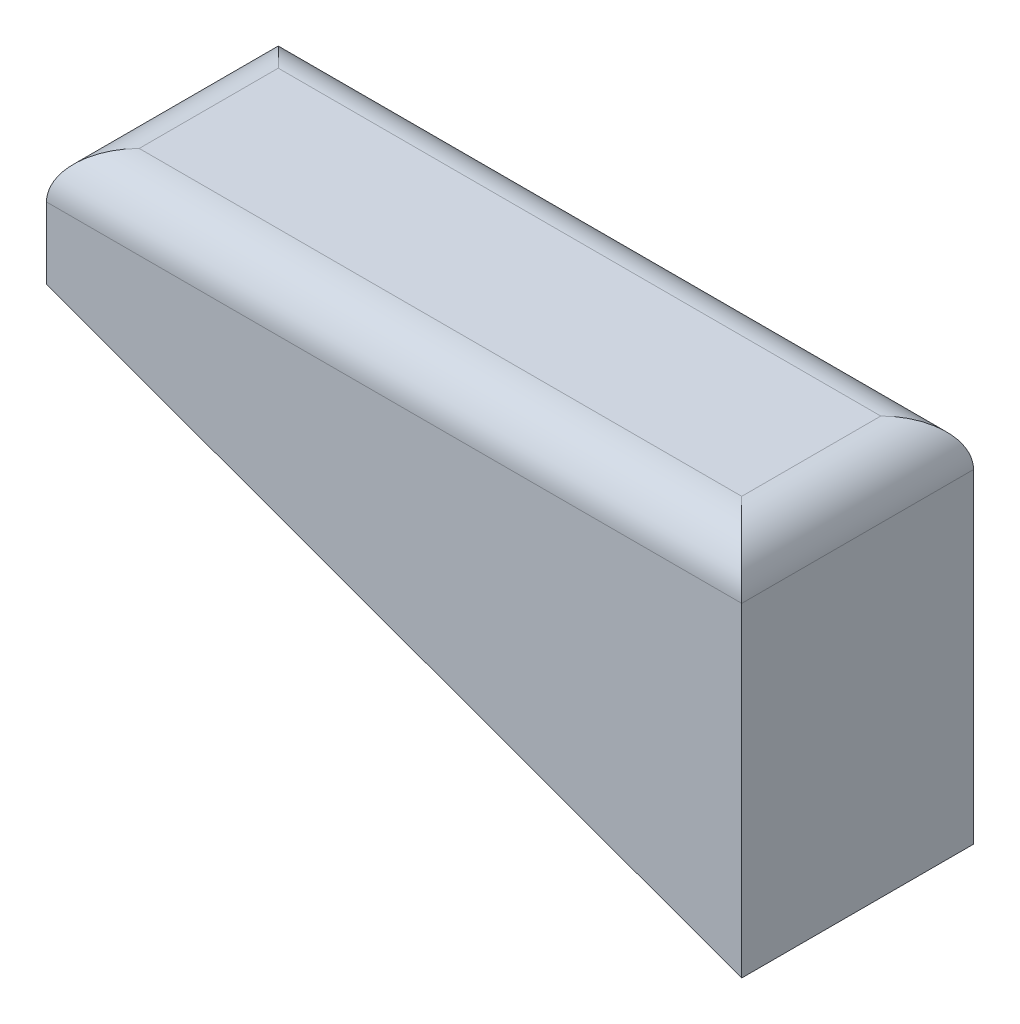
ISO-10303-21;
HEADER;
FILE_DESCRIPTION(('STEP AP214'),'2;1');
FILE_NAME('part.step','',(''),(''),'','','');
FILE_SCHEMA(('AUTOMOTIVE_DESIGN { 1 0 10303 214 1 1 1 1 }'));
ENDSEC;
DATA;
#1=APPLICATION_CONTEXT('core data for automotive mechanical design processes');
#2=APPLICATION_PROTOCOL_DEFINITION('international standard','automotive_design',2000,#1);
#3=PRODUCT_CONTEXT('',#1,'mechanical');
#4=PRODUCT('Part','Part','',(#3));
#5=PRODUCT_RELATED_PRODUCT_CATEGORY('part','',(#4));
#6=PRODUCT_DEFINITION_FORMATION('','',#4);
#7=PRODUCT_DEFINITION_CONTEXT('part definition',#1,'design');
#8=PRODUCT_DEFINITION('design','',#6,#7);
#9=PRODUCT_DEFINITION_SHAPE('','',#8);
#10=(LENGTH_UNIT() NAMED_UNIT(*) SI_UNIT(.MILLI.,.METRE.));
#11=(NAMED_UNIT(*) PLANE_ANGLE_UNIT() SI_UNIT($,.RADIAN.));
#12=(NAMED_UNIT(*) SI_UNIT($,.STERADIAN.) SOLID_ANGLE_UNIT());
#13=UNCERTAINTY_MEASURE_WITH_UNIT(LENGTH_MEASURE(1.E-05),#10,'distance_accuracy_value','');
#14=(GEOMETRIC_REPRESENTATION_CONTEXT(3) GLOBAL_UNCERTAINTY_ASSIGNED_CONTEXT((#13)) GLOBAL_UNIT_ASSIGNED_CONTEXT((#10,
#11,#12)) REPRESENTATION_CONTEXT('',''));
#15=CARTESIAN_POINT('',(0.,0.,0.));
#16=DIRECTION('',(0.,0.,1.));
#17=DIRECTION('',(1.,0.,0.));
#18=AXIS2_PLACEMENT_3D('',#15,#16,#17);
#19=CARTESIAN_POINT('',(0.,0.,5.));
#20=DIRECTION('',(1.,0.,0.));
#21=DIRECTION('',(0.,1.,0.));
#22=AXIS2_PLACEMENT_3D('',#19,#20,#21);
#23=PLANE('',#22);
#24=DIRECTION('',(0.,-1.,0.));
#25=VECTOR('',#24,1.);
#26=CARTESIAN_POINT('',(0.,0.,0.));
#27=LINE('',#26,#25);
#28=CARTESIAN_POINT('',(0.,7.,0.));
#29=VERTEX_POINT('',#28);
#30=CARTESIAN_POINT('',(0.,0.,0.));
#31=VERTEX_POINT('',#30);
#32=EDGE_CURVE('E113',#29,#31,#27,.T.);
#33=ORIENTED_EDGE('',*,*,#32,.F.);
#34=DIRECTION('',(0.,0.,-1.));
#35=VECTOR('',#34,1.);
#36=CARTESIAN_POINT('',(0.,7.,5.));
#37=LINE('',#36,#35);
#38=CARTESIAN_POINT('',(0.,7.,5.));
#39=VERTEX_POINT('',#38);
#40=EDGE_CURVE('E11',#29,#39,#37,.F.);
#41=ORIENTED_EDGE('',*,*,#40,.T.);
#42=DIRECTION('',(0.,-1.,0.));
#43=VECTOR('',#42,1.);
#44=CARTESIAN_POINT('',(0.,0.,5.));
#45=LINE('',#44,#43);
#46=CARTESIAN_POINT('',(0.,0.,5.));
#47=VERTEX_POINT('',#46);
#48=EDGE_CURVE('E104',#39,#47,#45,.T.);
#49=ORIENTED_EDGE('',*,*,#48,.T.);
#50=DIRECTION('',(0.,0.,-1.));
#51=VECTOR('',#50,1.);
#52=CARTESIAN_POINT('',(0.,0.,5.));
#53=LINE('',#52,#51);
#54=EDGE_CURVE('E99',#47,#31,#53,.T.);
#55=ORIENTED_EDGE('',*,*,#54,.T.);
#56=EDGE_LOOP('',(#33,#41,#49,#55));
#57=FACE_BOUND('',#56,.T.);
#58=ADVANCED_FACE('F35',(#57),#23,.T.);
#59=CARTESIAN_POINT('',(0.,8.,5.));
#60=DIRECTION('',(0.,1.,0.));
#61=DIRECTION('',(0.,0.,1.));
#62=AXIS2_PLACEMENT_3D('',#59,#60,#61);
#63=PLANE('',#62);
#64=DIRECTION('',(0.,0.,-1.));
#65=VECTOR('',#64,1.);
#66=CARTESIAN_POINT('',(-1.,8.,5.));
#67=LINE('',#66,#65);
#68=CARTESIAN_POINT('',(-1.,8.,4.));
#69=VERTEX_POINT('',#68);
#70=CARTESIAN_POINT('',(-1.,8.,1.));
#71=VERTEX_POINT('',#70);
#72=EDGE_CURVE('E120',#69,#71,#67,.T.);
#73=ORIENTED_EDGE('',*,*,#72,.T.);
#74=DIRECTION('',(1.,0.,0.));
#75=VECTOR('',#74,1.);
#76=CARTESIAN_POINT('',(-15.,8.,1.));
#77=LINE('',#76,#75);
#78=CARTESIAN_POINT('',(-14.,8.,1.));
#79=VERTEX_POINT('',#78);
#80=EDGE_CURVE('E126',#71,#79,#77,.F.);
#81=ORIENTED_EDGE('',*,*,#80,.T.);
#82=DIRECTION('',(0.,0.,-1.));
#83=VECTOR('',#82,1.);
#84=CARTESIAN_POINT('',(-14.,8.,5.));
#85=LINE('',#84,#83);
#86=CARTESIAN_POINT('',(-14.,8.,4.));
#87=VERTEX_POINT('',#86);
#88=EDGE_CURVE('E124',#79,#87,#85,.F.);
#89=ORIENTED_EDGE('',*,*,#88,.T.);
#90=DIRECTION('',(1.,0.,0.));
#91=VECTOR('',#90,1.);
#92=CARTESIAN_POINT('',(0.,8.,4.));
#93=LINE('',#92,#91);
#94=EDGE_CURVE('E122',#87,#69,#93,.T.);
#95=ORIENTED_EDGE('',*,*,#94,.T.);
#96=EDGE_LOOP('',(#73,#81,#89,#95));
#97=FACE_BOUND('',#96,.T.);
#98=ADVANCED_FACE('F149',(#97),#63,.T.);
#99=CARTESIAN_POINT('',(-15.,0.,5.));
#100=DIRECTION('',(-1.,0.,0.));
#101=DIRECTION('',(0.,0.,1.));
#102=AXIS2_PLACEMENT_3D('',#99,#100,#101);
#103=PLANE('',#102);
#104=DIRECTION('',(0.,1.,0.));
#105=VECTOR('',#104,1.);
#106=CARTESIAN_POINT('',(-15.,0.,5.));
#107=LINE('',#106,#105);
#108=CARTESIAN_POINT('',(-15.,5.45955351399304,5.));
#109=VERTEX_POINT('',#108);
#110=CARTESIAN_POINT('',(-15.,7.,5.));
#111=VERTEX_POINT('',#110);
#112=EDGE_CURVE('E90',#109,#111,#107,.T.);
#113=ORIENTED_EDGE('',*,*,#112,.T.);
#114=DIRECTION('',(0.,0.,-1.));
#115=VECTOR('',#114,1.);
#116=CARTESIAN_POINT('',(-15.,7.,5.));
#117=LINE('',#116,#115);
#118=CARTESIAN_POINT('',(-15.,7.,0.));
#119=VERTEX_POINT('',#118);
#120=EDGE_CURVE('E129',#111,#119,#117,.T.);
#121=ORIENTED_EDGE('',*,*,#120,.T.);
#122=DIRECTION('',(0.,1.,0.));
#123=VECTOR('',#122,1.);
#124=CARTESIAN_POINT('',(-15.,0.,0.));
#125=LINE('',#124,#123);
#126=CARTESIAN_POINT('',(-15.,5.45955351399304,0.));
#127=VERTEX_POINT('',#126);
#128=EDGE_CURVE('E93',#127,#119,#125,.T.);
#129=ORIENTED_EDGE('',*,*,#128,.F.);
#130=DIRECTION('',(0.,0.,-1.));
#131=VECTOR('',#130,1.);
#132=CARTESIAN_POINT('',(-15.,5.45955351399304,5.));
#133=LINE('',#132,#131);
#134=EDGE_CURVE('E88',#109,#127,#133,.T.);
#135=ORIENTED_EDGE('',*,*,#134,.F.);
#136=EDGE_LOOP('',(#113,#121,#129,#135));
#137=FACE_BOUND('',#136,.T.);
#138=ADVANCED_FACE('F89',(#137),#103,.T.);
#139=CARTESIAN_POINT('',(0.,0.,5.));
#140=DIRECTION('',(-0.342020143325669,-0.939692620785908,0.));
#141=DIRECTION('',(0.939692620785908,-0.342020143325669,0.));
#142=AXIS2_PLACEMENT_3D('',#139,#140,#141);
#143=PLANE('',#142);
#144=DIRECTION('',(-0.939692620785908,0.342020143325669,0.));
#145=VECTOR('',#144,1.);
#146=CARTESIAN_POINT('',(0.,0.,0.));
#147=LINE('',#146,#145);
#148=EDGE_CURVE('E116',#31,#127,#147,.T.);
#149=ORIENTED_EDGE('',*,*,#148,.F.);
#150=ORIENTED_EDGE('',*,*,#54,.F.);
#151=DIRECTION('',(-0.939692620785908,0.342020143325669,0.));
#152=VECTOR('',#151,1.);
#153=CARTESIAN_POINT('',(0.,0.,5.));
#154=LINE('',#153,#152);
#155=EDGE_CURVE('E103',#47,#109,#154,.T.);
#156=ORIENTED_EDGE('',*,*,#155,.T.);
#157=ORIENTED_EDGE('',*,*,#134,.T.);
#158=EDGE_LOOP('',(#149,#150,#156,#157));
#159=FACE_BOUND('',#158,.T.);
#160=ADVANCED_FACE('F107',(#159),#143,.T.);
#161=CARTESIAN_POINT('',(0.,0.,5.));
#162=DIRECTION('',(0.,0.,1.));
#163=DIRECTION('',(1.,0.,0.));
#164=AXIS2_PLACEMENT_3D('',#161,#162,#163);
#165=PLANE('',#164);
#166=ORIENTED_EDGE('',*,*,#48,.F.);
#167=DIRECTION('',(1.,0.,0.));
#168=VECTOR('',#167,1.);
#169=CARTESIAN_POINT('',(0.,7.,5.));
#170=LINE('',#169,#168);
#171=EDGE_CURVE('E44',#39,#111,#170,.F.);
#172=ORIENTED_EDGE('',*,*,#171,.T.);
#173=ORIENTED_EDGE('',*,*,#112,.F.);
#174=ORIENTED_EDGE('',*,*,#155,.F.);
#175=EDGE_LOOP('',(#166,#172,#173,#174));
#176=FACE_BOUND('',#175,.T.);
#177=ADVANCED_FACE('F102',(#176),#165,.T.);
#178=CARTESIAN_POINT('',(0.,0.,0.));
#179=DIRECTION('',(0.,0.,1.));
#180=DIRECTION('',(1.,0.,0.));
#181=AXIS2_PLACEMENT_3D('',#178,#179,#180);
#182=PLANE('',#181);
#183=ORIENTED_EDGE('',*,*,#128,.T.);
#184=DIRECTION('',(1.,0.,0.));
#185=VECTOR('',#184,1.);
#186=CARTESIAN_POINT('',(0.,7.,0.));
#187=LINE('',#186,#185);
#188=EDGE_CURVE('E98',#119,#29,#187,.T.);
#189=ORIENTED_EDGE('',*,*,#188,.T.);
#190=ORIENTED_EDGE('',*,*,#32,.T.);
#191=ORIENTED_EDGE('',*,*,#148,.T.);
#192=EDGE_LOOP('',(#183,#189,#190,#191));
#193=FACE_BOUND('',#192,.T.);
#194=ADVANCED_FACE('F157',(#193),#182,.F.);
#195=CARTESIAN_POINT('',(0.,7.,4.));
#196=DIRECTION('',(1.,0.,0.));
#197=DIRECTION('',(0.,0.,-1.));
#198=AXIS2_PLACEMENT_3D('',#195,#196,#197);
#199=CYLINDRICAL_SURFACE('',#198,1.);
#200=CARTESIAN_POINT('',(-1.,7.,4.));
#201=DIRECTION('',(0.707106781186547,0.,-0.707106781186547));
#202=DIRECTION('',(-0.707106781186547,0.,-0.707106781186547));
#203=AXIS2_PLACEMENT_3D('',#200,#201,#202);
#204=ELLIPSE('',#203,1.41421356237309,1.);
#205=EDGE_CURVE('E135',#69,#39,#204,.T.);
#206=ORIENTED_EDGE('',*,*,#205,.F.);
#207=ORIENTED_EDGE('',*,*,#94,.F.);
#208=CARTESIAN_POINT('',(-14.,7.,4.));
#209=DIRECTION('',(0.707106781186547,0.,0.707106781186547));
#210=DIRECTION('',(0.707106781186547,0.,-0.707106781186547));
#211=AXIS2_PLACEMENT_3D('',#208,#209,#210);
#212=ELLIPSE('',#211,1.41421356237309,1.);
#213=EDGE_CURVE('E39',#111,#87,#212,.F.);
#214=ORIENTED_EDGE('',*,*,#213,.F.);
#215=ORIENTED_EDGE('',*,*,#171,.F.);
#216=EDGE_LOOP('',(#206,#207,#214,#215));
#217=FACE_BOUND('',#216,.T.);
#218=ADVANCED_FACE('F37',(#217),#199,.T.);
#219=CARTESIAN_POINT('',(-14.,7.,5.));
#220=DIRECTION('',(0.,0.,-1.));
#221=DIRECTION('',(-1.,0.,0.));
#222=AXIS2_PLACEMENT_3D('',#219,#220,#221);
#223=CYLINDRICAL_SURFACE('',#222,1.);
#224=ORIENTED_EDGE('',*,*,#213,.T.);
#225=ORIENTED_EDGE('',*,*,#88,.F.);
#226=CARTESIAN_POINT('',(-14.,7.,1.));
#227=DIRECTION('',(0.707106781186547,0.,-0.707106781186547));
#228=DIRECTION('',(-0.707106781186547,0.,-0.707106781186547));
#229=AXIS2_PLACEMENT_3D('',#226,#227,#228);
#230=ELLIPSE('',#229,1.41421356237309,1.);
#231=EDGE_CURVE('E134',#119,#79,#230,.T.);
#232=ORIENTED_EDGE('',*,*,#231,.F.);
#233=ORIENTED_EDGE('',*,*,#120,.F.);
#234=EDGE_LOOP('',(#224,#225,#232,#233));
#235=FACE_BOUND('',#234,.T.);
#236=ADVANCED_FACE('F144',(#235),#223,.T.);
#237=CARTESIAN_POINT('',(-1.,7.,5.));
#238=DIRECTION('',(0.,0.,-1.));
#239=DIRECTION('',(-1.,0.,0.));
#240=AXIS2_PLACEMENT_3D('',#237,#238,#239);
#241=CYLINDRICAL_SURFACE('',#240,1.);
#242=ORIENTED_EDGE('',*,*,#205,.T.);
#243=ORIENTED_EDGE('',*,*,#40,.F.);
#244=CARTESIAN_POINT('',(-1.,7.,1.));
#245=DIRECTION('',(-0.707106781186547,0.,-0.707106781186547));
#246=DIRECTION('',(0.707106781186547,0.,-0.707106781186547));
#247=AXIS2_PLACEMENT_3D('',#244,#245,#246);
#248=ELLIPSE('',#247,1.41421356237309,1.);
#249=EDGE_CURVE('E132',#71,#29,#248,.T.);
#250=ORIENTED_EDGE('',*,*,#249,.F.);
#251=ORIENTED_EDGE('',*,*,#72,.F.);
#252=EDGE_LOOP('',(#242,#243,#250,#251));
#253=FACE_BOUND('',#252,.T.);
#254=ADVANCED_FACE('F155',(#253),#241,.T.);
#255=CARTESIAN_POINT('',(0.,7.,1.));
#256=DIRECTION('',(-1.,0.,0.));
#257=DIRECTION('',(0.,0.,1.));
#258=AXIS2_PLACEMENT_3D('',#255,#256,#257);
#259=CYLINDRICAL_SURFACE('',#258,1.);
#260=ORIENTED_EDGE('',*,*,#231,.T.);
#261=ORIENTED_EDGE('',*,*,#80,.F.);
#262=ORIENTED_EDGE('',*,*,#249,.T.);
#263=ORIENTED_EDGE('',*,*,#188,.F.);
#264=EDGE_LOOP('',(#260,#261,#262,#263));
#265=FACE_BOUND('',#264,.T.);
#266=ADVANCED_FACE('F153',(#265),#259,.T.);
#267=CLOSED_SHELL('',(#58,#98,#138,#160,#177,#194,#218,#236,#254,#266));
#268=MANIFOLD_SOLID_BREP('B2',#267);
#269=ADVANCED_BREP_SHAPE_REPRESENTATION('',(#18,#268),#14);
#270=SHAPE_DEFINITION_REPRESENTATION(#9,#269);
ENDSEC;
END-ISO-10303-21;
